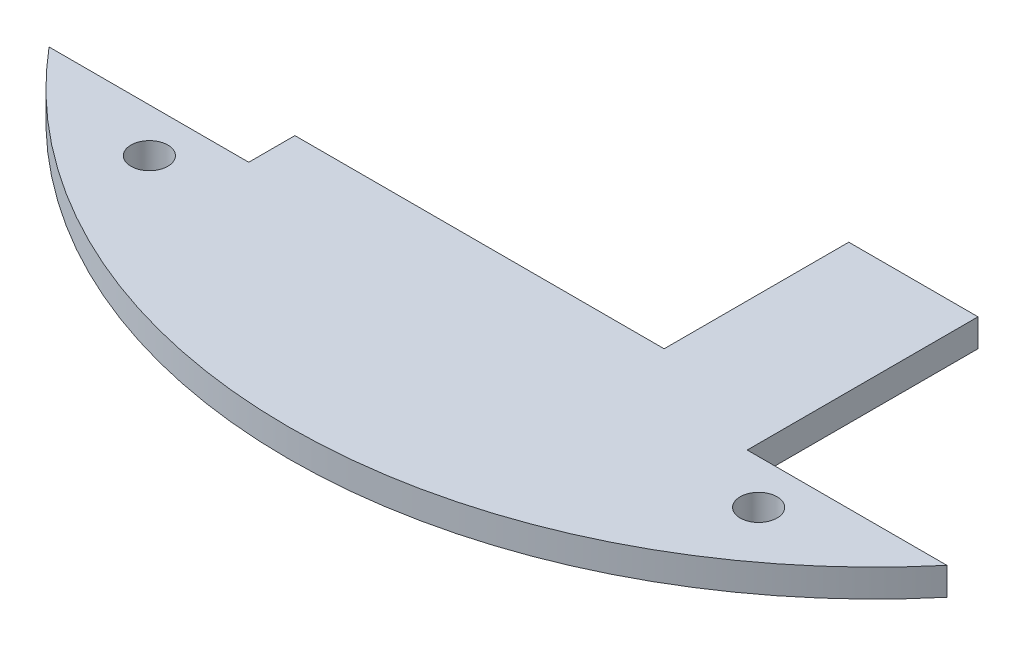
ISO-10303-21;
HEADER;
FILE_DESCRIPTION(('STEP AP214'),'2;1');
FILE_NAME('part.step','',(''),(''),'','','');
FILE_SCHEMA(('AUTOMOTIVE_DESIGN { 1 0 10303 214 1 1 1 1 }'));
ENDSEC;
DATA;
#1=APPLICATION_CONTEXT('core data for automotive mechanical design processes');
#2=APPLICATION_PROTOCOL_DEFINITION('international standard','automotive_design',2000,#1);
#3=PRODUCT_CONTEXT('',#1,'mechanical');
#4=PRODUCT('Part','Part','',(#3));
#5=PRODUCT_RELATED_PRODUCT_CATEGORY('part','',(#4));
#6=PRODUCT_DEFINITION_FORMATION('','',#4);
#7=PRODUCT_DEFINITION_CONTEXT('part definition',#1,'design');
#8=PRODUCT_DEFINITION('design','',#6,#7);
#9=PRODUCT_DEFINITION_SHAPE('','',#8);
#10=(LENGTH_UNIT() NAMED_UNIT(*) SI_UNIT(.MILLI.,.METRE.));
#11=(NAMED_UNIT(*) PLANE_ANGLE_UNIT() SI_UNIT($,.RADIAN.));
#12=(NAMED_UNIT(*) SI_UNIT($,.STERADIAN.) SOLID_ANGLE_UNIT());
#13=UNCERTAINTY_MEASURE_WITH_UNIT(LENGTH_MEASURE(1.E-05),#10,'distance_accuracy_value','');
#14=(GEOMETRIC_REPRESENTATION_CONTEXT(3) GLOBAL_UNCERTAINTY_ASSIGNED_CONTEXT((#13)) GLOBAL_UNIT_ASSIGNED_CONTEXT((#10,
#11,#12)) REPRESENTATION_CONTEXT('',''));
#15=CARTESIAN_POINT('',(0.,0.,0.));
#16=DIRECTION('',(0.,0.,1.));
#17=DIRECTION('',(1.,0.,0.));
#18=AXIS2_PLACEMENT_3D('',#15,#16,#17);
#19=CARTESIAN_POINT('',(13.5,1.5,-17.9136652802601));
#20=DIRECTION('',(0.,1.,0.));
#21=DIRECTION('',(0.,0.,1.));
#22=AXIS2_PLACEMENT_3D('',#19,#20,#21);
#23=PLANE('',#22);
#24=CARTESIAN_POINT('',(30.,1.5,4.88196121295741));
#25=DIRECTION('',(0.,1.,0.));
#26=DIRECTION('',(0.,0.,1.));
#27=AXIS2_PLACEMENT_3D('',#24,#25,#26);
#28=CIRCLE('',#27,1.00000000000001);
#29=CARTESIAN_POINT('',(30.,1.5,5.88196121295741));
#30=VERTEX_POINT('',#29);
#31=EDGE_CURVE('E135',#30,#30,#28,.T.);
#32=ORIENTED_EDGE('',*,*,#31,.F.);
#33=EDGE_LOOP('',(#32));
#34=FACE_BOUND('',#33,.T.);
#35=DIRECTION('',(-1.,0.,0.));
#36=VECTOR('',#35,1.);
#37=CARTESIAN_POINT('',(27.,1.5,2.5));
#38=LINE('',#37,#36);
#39=CARTESIAN_POINT('',(37.8175814962241,1.5,2.5));
#40=VERTEX_POINT('',#39);
#41=CARTESIAN_POINT('',(27.,1.5,2.5));
#42=VERTEX_POINT('',#41);
#43=EDGE_CURVE('E147',#40,#42,#38,.T.);
#44=ORIENTED_EDGE('',*,*,#43,.T.);
#45=DIRECTION('',(0.,0.,-1.));
#46=VECTOR('',#45,1.);
#47=CARTESIAN_POINT('',(27.,1.5,0.));
#48=LINE('',#47,#46);
#49=CARTESIAN_POINT('',(27.,1.5,-10.));
#50=VERTEX_POINT('',#49);
#51=EDGE_CURVE('E91',#42,#50,#48,.T.);
#52=ORIENTED_EDGE('',*,*,#51,.T.);
#53=DIRECTION('',(-1.,0.,0.));
#54=VECTOR('',#53,1.);
#55=CARTESIAN_POINT('',(27.,1.5,-10.));
#56=LINE('',#55,#54);
#57=CARTESIAN_POINT('',(20.,1.5,-10.));
#58=VERTEX_POINT('',#57);
#59=EDGE_CURVE('E162',#50,#58,#56,.T.);
#60=ORIENTED_EDGE('',*,*,#59,.T.);
#61=DIRECTION('',(0.,0.,1.));
#62=VECTOR('',#61,1.);
#63=CARTESIAN_POINT('',(20.,1.5,0.));
#64=LINE('',#63,#62);
#65=CARTESIAN_POINT('',(20.,1.5,0.));
#66=VERTEX_POINT('',#65);
#67=EDGE_CURVE('E173',#58,#66,#64,.T.);
#68=ORIENTED_EDGE('',*,*,#67,.T.);
#69=DIRECTION('',(-1.,0.,0.));
#70=VECTOR('',#69,1.);
#71=CARTESIAN_POINT('',(0.,1.5,0.));
#72=LINE('',#71,#70);
#73=CARTESIAN_POINT('',(0.,1.5,0.));
#74=VERTEX_POINT('',#73);
#75=EDGE_CURVE('E111',#66,#74,#72,.T.);
#76=ORIENTED_EDGE('',*,*,#75,.T.);
#77=DIRECTION('',(0.,0.,1.));
#78=VECTOR('',#77,1.);
#79=CARTESIAN_POINT('',(0.,1.5,0.));
#80=LINE('',#79,#78);
#81=CARTESIAN_POINT('',(0.,1.5,2.5));
#82=VERTEX_POINT('',#81);
#83=EDGE_CURVE('E104',#74,#82,#80,.T.);
#84=ORIENTED_EDGE('',*,*,#83,.T.);
#85=DIRECTION('',(-1.,0.,0.));
#86=VECTOR('',#85,1.);
#87=CARTESIAN_POINT('',(0.,1.5,2.5));
#88=LINE('',#87,#86);
#89=CARTESIAN_POINT('',(-10.8175814962241,1.5,2.5));
#90=VERTEX_POINT('',#89);
#91=EDGE_CURVE('E108',#82,#90,#88,.T.);
#92=ORIENTED_EDGE('',*,*,#91,.T.);
#93=CARTESIAN_POINT('',(13.5,1.5,-17.9136652802601));
#94=DIRECTION('',(0.,1.,0.));
#95=DIRECTION('',(0.,0.,-1.));
#96=AXIS2_PLACEMENT_3D('',#93,#94,#95);
#97=CIRCLE('',#96,31.75);
#98=EDGE_CURVE('E50',#90,#40,#97,.T.);
#99=ORIENTED_EDGE('',*,*,#98,.T.);
#100=EDGE_LOOP('',(#44,#52,#60,#68,#76,#84,#92,#99));
#101=FACE_BOUND('',#100,.T.);
#102=CARTESIAN_POINT('',(-3.,1.5,4.88196121295741));
#103=DIRECTION('',(0.,1.,0.));
#104=DIRECTION('',(0.,0.,-1.));
#105=AXIS2_PLACEMENT_3D('',#102,#103,#104);
#106=CIRCLE('',#105,1.00000000000001);
#107=CARTESIAN_POINT('',(-3.,1.5,3.8819612129574));
#108=VERTEX_POINT('',#107);
#109=EDGE_CURVE('E182',#108,#108,#106,.T.);
#110=ORIENTED_EDGE('',*,*,#109,.F.);
#111=EDGE_LOOP('',(#110));
#112=FACE_BOUND('',#111,.T.);
#113=ADVANCED_FACE('F33',(#34,#101,#112),#23,.T.);
#114=CARTESIAN_POINT('',(13.5,0.,-17.9136652802601));
#115=DIRECTION('',(0.,1.,0.));
#116=DIRECTION('',(0.,0.,1.));
#117=AXIS2_PLACEMENT_3D('',#114,#115,#116);
#118=PLANE('',#117);
#119=CARTESIAN_POINT('',(30.,0.,4.88196121295741));
#120=DIRECTION('',(0.,1.,0.));
#121=DIRECTION('',(0.,0.,1.));
#122=AXIS2_PLACEMENT_3D('',#119,#120,#121);
#123=CIRCLE('',#122,1.00000000000001);
#124=CARTESIAN_POINT('',(30.,0.,5.88196121295741));
#125=VERTEX_POINT('',#124);
#126=EDGE_CURVE('E179',#125,#125,#123,.T.);
#127=ORIENTED_EDGE('',*,*,#126,.T.);
#128=EDGE_LOOP('',(#127));
#129=FACE_BOUND('',#128,.T.);
#130=DIRECTION('',(-1.,0.,0.));
#131=VECTOR('',#130,1.);
#132=CARTESIAN_POINT('',(27.,0.,2.5));
#133=LINE('',#132,#131);
#134=CARTESIAN_POINT('',(37.8175814962241,0.,2.5));
#135=VERTEX_POINT('',#134);
#136=CARTESIAN_POINT('',(27.,0.,2.5));
#137=VERTEX_POINT('',#136);
#138=EDGE_CURVE('E131',#135,#137,#133,.T.);
#139=ORIENTED_EDGE('',*,*,#138,.F.);
#140=CARTESIAN_POINT('',(13.5,0.,-17.9136652802601));
#141=DIRECTION('',(0.,1.,0.));
#142=DIRECTION('',(0.,0.,1.));
#143=AXIS2_PLACEMENT_3D('',#140,#141,#142);
#144=CIRCLE('',#143,31.75);
#145=CARTESIAN_POINT('',(-10.8175814962241,0.,2.5));
#146=VERTEX_POINT('',#145);
#147=EDGE_CURVE('E79',#146,#135,#144,.T.);
#148=ORIENTED_EDGE('',*,*,#147,.F.);
#149=DIRECTION('',(-1.,0.,0.));
#150=VECTOR('',#149,1.);
#151=CARTESIAN_POINT('',(0.,0.,2.5));
#152=LINE('',#151,#150);
#153=CARTESIAN_POINT('',(0.,0.,2.5));
#154=VERTEX_POINT('',#153);
#155=EDGE_CURVE('E144',#154,#146,#152,.T.);
#156=ORIENTED_EDGE('',*,*,#155,.F.);
#157=DIRECTION('',(0.,0.,1.));
#158=VECTOR('',#157,1.);
#159=CARTESIAN_POINT('',(0.,0.,0.));
#160=LINE('',#159,#158);
#161=CARTESIAN_POINT('',(0.,0.,0.));
#162=VERTEX_POINT('',#161);
#163=EDGE_CURVE('E120',#162,#154,#160,.T.);
#164=ORIENTED_EDGE('',*,*,#163,.F.);
#165=DIRECTION('',(-1.,0.,0.));
#166=VECTOR('',#165,1.);
#167=CARTESIAN_POINT('',(0.,0.,0.));
#168=LINE('',#167,#166);
#169=CARTESIAN_POINT('',(20.,0.,0.));
#170=VERTEX_POINT('',#169);
#171=EDGE_CURVE('E141',#170,#162,#168,.T.);
#172=ORIENTED_EDGE('',*,*,#171,.F.);
#173=DIRECTION('',(0.,0.,1.));
#174=VECTOR('',#173,1.);
#175=CARTESIAN_POINT('',(20.,0.,0.));
#176=LINE('',#175,#174);
#177=CARTESIAN_POINT('',(20.,0.,-10.));
#178=VERTEX_POINT('',#177);
#179=EDGE_CURVE('E139',#178,#170,#176,.T.);
#180=ORIENTED_EDGE('',*,*,#179,.F.);
#181=DIRECTION('',(-1.,0.,0.));
#182=VECTOR('',#181,1.);
#183=CARTESIAN_POINT('',(27.,0.,-10.));
#184=LINE('',#183,#182);
#185=CARTESIAN_POINT('',(27.,0.,-10.));
#186=VERTEX_POINT('',#185);
#187=EDGE_CURVE('E137',#186,#178,#184,.T.);
#188=ORIENTED_EDGE('',*,*,#187,.F.);
#189=DIRECTION('',(0.,0.,-1.));
#190=VECTOR('',#189,1.);
#191=CARTESIAN_POINT('',(27.,0.,0.));
#192=LINE('',#191,#190);
#193=EDGE_CURVE('E134',#137,#186,#192,.T.);
#194=ORIENTED_EDGE('',*,*,#193,.F.);
#195=EDGE_LOOP('',(#139,#148,#156,#164,#172,#180,#188,#194));
#196=FACE_BOUND('',#195,.T.);
#197=CARTESIAN_POINT('',(-3.,0.,4.88196121295741));
#198=DIRECTION('',(0.,1.,0.));
#199=DIRECTION('',(0.,0.,-1.));
#200=AXIS2_PLACEMENT_3D('',#197,#198,#199);
#201=CIRCLE('',#200,1.00000000000001);
#202=CARTESIAN_POINT('',(-3.,0.,3.8819612129574));
#203=VERTEX_POINT('',#202);
#204=EDGE_CURVE('E185',#203,#203,#201,.T.);
#205=ORIENTED_EDGE('',*,*,#204,.T.);
#206=EDGE_LOOP('',(#205));
#207=FACE_BOUND('',#206,.T.);
#208=ADVANCED_FACE('F164',(#129,#196,#207),#118,.F.);
#209=CARTESIAN_POINT('',(27.,1.5,2.5));
#210=DIRECTION('',(0.,0.,1.));
#211=DIRECTION('',(1.,0.,0.));
#212=AXIS2_PLACEMENT_3D('',#209,#210,#211);
#213=PLANE('',#212);
#214=ORIENTED_EDGE('',*,*,#138,.T.);
#215=DIRECTION('',(0.,-1.,0.));
#216=VECTOR('',#215,1.);
#217=CARTESIAN_POINT('',(27.,1.5,2.5));
#218=LINE('',#217,#216);
#219=EDGE_CURVE('E11',#42,#137,#218,.T.);
#220=ORIENTED_EDGE('',*,*,#219,.F.);
#221=ORIENTED_EDGE('',*,*,#43,.F.);
#222=DIRECTION('',(0.,-1.,0.));
#223=VECTOR('',#222,1.);
#224=CARTESIAN_POINT('',(37.8175814962241,1.5,2.5));
#225=LINE('',#224,#223);
#226=EDGE_CURVE('E127',#40,#135,#225,.T.);
#227=ORIENTED_EDGE('',*,*,#226,.T.);
#228=EDGE_LOOP('',(#214,#220,#221,#227));
#229=FACE_BOUND('',#228,.T.);
#230=ADVANCED_FACE('F35',(#229),#213,.F.);
#231=CARTESIAN_POINT('',(27.,1.5,0.));
#232=DIRECTION('',(-1.,0.,0.));
#233=DIRECTION('',(0.,0.,1.));
#234=AXIS2_PLACEMENT_3D('',#231,#232,#233);
#235=PLANE('',#234);
#236=ORIENTED_EDGE('',*,*,#193,.T.);
#237=DIRECTION('',(0.,-1.,0.));
#238=VECTOR('',#237,1.);
#239=CARTESIAN_POINT('',(27.,1.5,-10.));
#240=LINE('',#239,#238);
#241=EDGE_CURVE('E42',#50,#186,#240,.T.);
#242=ORIENTED_EDGE('',*,*,#241,.F.);
#243=ORIENTED_EDGE('',*,*,#51,.F.);
#244=ORIENTED_EDGE('',*,*,#219,.T.);
#245=EDGE_LOOP('',(#236,#242,#243,#244));
#246=FACE_BOUND('',#245,.T.);
#247=ADVANCED_FACE('F218',(#246),#235,.F.);
#248=CARTESIAN_POINT('',(27.,1.5,-10.));
#249=DIRECTION('',(0.,0.,1.));
#250=DIRECTION('',(1.,0.,0.));
#251=AXIS2_PLACEMENT_3D('',#248,#249,#250);
#252=PLANE('',#251);
#253=ORIENTED_EDGE('',*,*,#187,.T.);
#254=DIRECTION('',(0.,-1.,0.));
#255=VECTOR('',#254,1.);
#256=CARTESIAN_POINT('',(20.,1.5,-10.));
#257=LINE('',#256,#255);
#258=EDGE_CURVE('E154',#58,#178,#257,.T.);
#259=ORIENTED_EDGE('',*,*,#258,.F.);
#260=ORIENTED_EDGE('',*,*,#59,.F.);
#261=ORIENTED_EDGE('',*,*,#241,.T.);
#262=EDGE_LOOP('',(#253,#259,#260,#261));
#263=FACE_BOUND('',#262,.T.);
#264=ADVANCED_FACE('F160',(#263),#252,.F.);
#265=CARTESIAN_POINT('',(20.,1.5,0.));
#266=DIRECTION('',(1.,0.,0.));
#267=DIRECTION('',(0.,0.,-1.));
#268=AXIS2_PLACEMENT_3D('',#265,#266,#267);
#269=PLANE('',#268);
#270=ORIENTED_EDGE('',*,*,#179,.T.);
#271=DIRECTION('',(0.,-1.,0.));
#272=VECTOR('',#271,1.);
#273=CARTESIAN_POINT('',(20.,1.5,0.));
#274=LINE('',#273,#272);
#275=EDGE_CURVE('E151',#66,#170,#274,.T.);
#276=ORIENTED_EDGE('',*,*,#275,.F.);
#277=ORIENTED_EDGE('',*,*,#67,.F.);
#278=ORIENTED_EDGE('',*,*,#258,.T.);
#279=EDGE_LOOP('',(#270,#276,#277,#278));
#280=FACE_BOUND('',#279,.T.);
#281=ADVANCED_FACE('F169',(#280),#269,.F.);
#282=CARTESIAN_POINT('',(0.,1.5,0.));
#283=DIRECTION('',(0.,0.,1.));
#284=DIRECTION('',(1.,0.,0.));
#285=AXIS2_PLACEMENT_3D('',#282,#283,#284);
#286=PLANE('',#285);
#287=ORIENTED_EDGE('',*,*,#171,.T.);
#288=DIRECTION('',(0.,-1.,0.));
#289=VECTOR('',#288,1.);
#290=CARTESIAN_POINT('',(0.,1.5,0.));
#291=LINE('',#290,#289);
#292=EDGE_CURVE('E122',#74,#162,#291,.T.);
#293=ORIENTED_EDGE('',*,*,#292,.F.);
#294=ORIENTED_EDGE('',*,*,#75,.F.);
#295=ORIENTED_EDGE('',*,*,#275,.T.);
#296=EDGE_LOOP('',(#287,#293,#294,#295));
#297=FACE_BOUND('',#296,.T.);
#298=ADVANCED_FACE('F172',(#297),#286,.F.);
#299=CARTESIAN_POINT('',(0.,1.5,0.));
#300=DIRECTION('',(1.,0.,0.));
#301=DIRECTION('',(0.,0.,-1.));
#302=AXIS2_PLACEMENT_3D('',#299,#300,#301);
#303=PLANE('',#302);
#304=ORIENTED_EDGE('',*,*,#163,.T.);
#305=DIRECTION('',(0.,-1.,0.));
#306=VECTOR('',#305,1.);
#307=CARTESIAN_POINT('',(0.,1.5,2.5));
#308=LINE('',#307,#306);
#309=EDGE_CURVE('E117',#82,#154,#308,.T.);
#310=ORIENTED_EDGE('',*,*,#309,.F.);
#311=ORIENTED_EDGE('',*,*,#83,.F.);
#312=ORIENTED_EDGE('',*,*,#292,.T.);
#313=EDGE_LOOP('',(#304,#310,#311,#312));
#314=FACE_BOUND('',#313,.T.);
#315=ADVANCED_FACE('F118',(#314),#303,.F.);
#316=CARTESIAN_POINT('',(0.,1.5,2.5));
#317=DIRECTION('',(0.,0.,1.));
#318=DIRECTION('',(1.,0.,0.));
#319=AXIS2_PLACEMENT_3D('',#316,#317,#318);
#320=PLANE('',#319);
#321=ORIENTED_EDGE('',*,*,#155,.T.);
#322=DIRECTION('',(0.,-1.,0.));
#323=VECTOR('',#322,1.);
#324=CARTESIAN_POINT('',(-10.8175814962241,1.5,2.5));
#325=LINE('',#324,#323);
#326=EDGE_CURVE('E123',#90,#146,#325,.T.);
#327=ORIENTED_EDGE('',*,*,#326,.F.);
#328=ORIENTED_EDGE('',*,*,#91,.F.);
#329=ORIENTED_EDGE('',*,*,#309,.T.);
#330=EDGE_LOOP('',(#321,#327,#328,#329));
#331=FACE_BOUND('',#330,.T.);
#332=ADVANCED_FACE('F125',(#331),#320,.F.);
#333=CARTESIAN_POINT('',(13.5,1.5,-17.9136652802601));
#334=DIRECTION('',(0.,-1.,0.));
#335=DIRECTION('',(0.,0.,-1.));
#336=AXIS2_PLACEMENT_3D('',#333,#334,#335);
#337=CYLINDRICAL_SURFACE('',#336,31.75);
#338=ORIENTED_EDGE('',*,*,#147,.T.);
#339=ORIENTED_EDGE('',*,*,#226,.F.);
#340=ORIENTED_EDGE('',*,*,#98,.F.);
#341=ORIENTED_EDGE('',*,*,#326,.T.);
#342=EDGE_LOOP('',(#338,#339,#340,#341));
#343=FACE_BOUND('',#342,.T.);
#344=ADVANCED_FACE('F206',(#343),#337,.T.);
#345=CARTESIAN_POINT('',(30.,1.5,4.88196121295741));
#346=DIRECTION('',(0.,-1.,0.));
#347=DIRECTION('',(0.,0.,-1.));
#348=AXIS2_PLACEMENT_3D('',#345,#346,#347);
#349=CYLINDRICAL_SURFACE('',#348,1.00000000000001);
#350=ORIENTED_EDGE('',*,*,#31,.T.);
#351=EDGE_LOOP('',(#350));
#352=FACE_BOUND('',#351,.T.);
#353=ORIENTED_EDGE('',*,*,#126,.F.);
#354=EDGE_LOOP('',(#353));
#355=FACE_BOUND('',#354,.T.);
#356=ADVANCED_FACE('F203',(#352,#355),#349,.F.);
#357=CARTESIAN_POINT('',(-3.,1.5,4.88196121295741));
#358=DIRECTION('',(0.,-1.,0.));
#359=DIRECTION('',(0.,0.,-1.));
#360=AXIS2_PLACEMENT_3D('',#357,#358,#359);
#361=CYLINDRICAL_SURFACE('',#360,1.00000000000001);
#362=ORIENTED_EDGE('',*,*,#109,.T.);
#363=EDGE_LOOP('',(#362));
#364=FACE_BOUND('',#363,.T.);
#365=ORIENTED_EDGE('',*,*,#204,.F.);
#366=EDGE_LOOP('',(#365));
#367=FACE_BOUND('',#366,.T.);
#368=ADVANCED_FACE('F191',(#364,#367),#361,.F.);
#369=CLOSED_SHELL('',(#113,#208,#230,#247,#264,#281,#298,#315,#332,#344,#356,#368));
#370=MANIFOLD_SOLID_BREP('B2',#369);
#371=ADVANCED_BREP_SHAPE_REPRESENTATION('',(#18,#370),#14);
#372=SHAPE_DEFINITION_REPRESENTATION(#9,#371);
ENDSEC;
END-ISO-10303-21;
